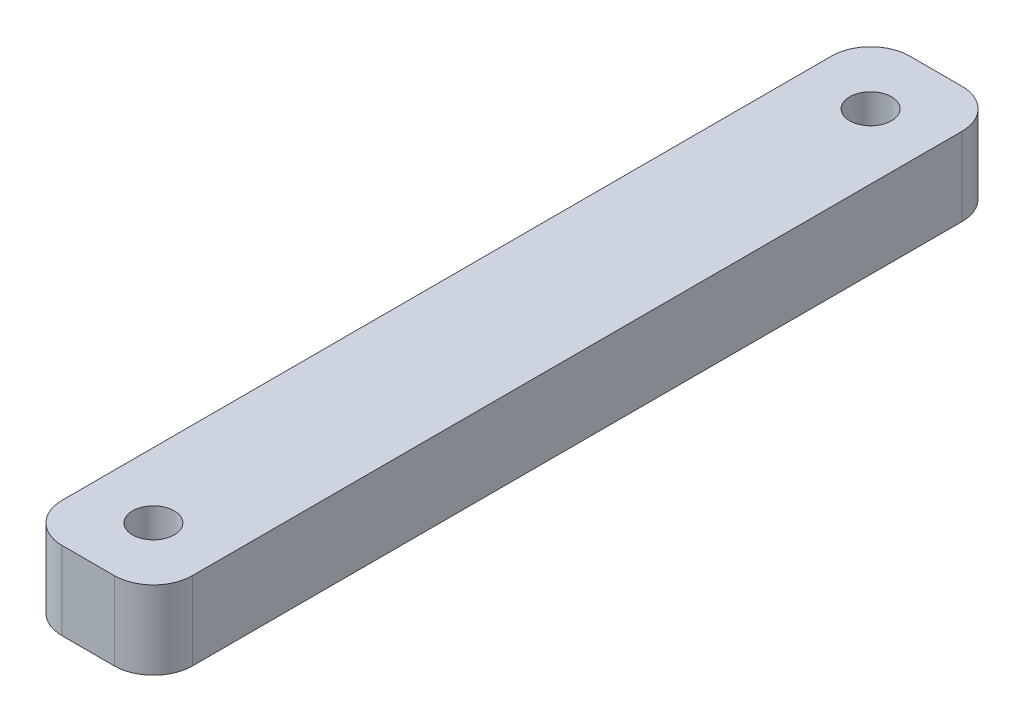
ISO-10303-21;
HEADER;
FILE_DESCRIPTION(('STEP AP214'),'2;1');
FILE_NAME('part.step','',(''),(''),'','','');
FILE_SCHEMA(('AUTOMOTIVE_DESIGN { 1 0 10303 214 1 1 1 1 }'));
ENDSEC;
DATA;
#1=APPLICATION_CONTEXT('core data for automotive mechanical design processes');
#2=APPLICATION_PROTOCOL_DEFINITION('international standard','automotive_design',2000,#1);
#3=PRODUCT_CONTEXT('',#1,'mechanical');
#4=PRODUCT('Part','Part','',(#3));
#5=PRODUCT_RELATED_PRODUCT_CATEGORY('part','',(#4));
#6=PRODUCT_DEFINITION_FORMATION('','',#4);
#7=PRODUCT_DEFINITION_CONTEXT('part definition',#1,'design');
#8=PRODUCT_DEFINITION('design','',#6,#7);
#9=PRODUCT_DEFINITION_SHAPE('','',#8);
#10=(LENGTH_UNIT() NAMED_UNIT(*) SI_UNIT(.MILLI.,.METRE.));
#11=(NAMED_UNIT(*) PLANE_ANGLE_UNIT() SI_UNIT($,.RADIAN.));
#12=(NAMED_UNIT(*) SI_UNIT($,.STERADIAN.) SOLID_ANGLE_UNIT());
#13=UNCERTAINTY_MEASURE_WITH_UNIT(LENGTH_MEASURE(1.E-05),#10,'distance_accuracy_value','');
#14=(GEOMETRIC_REPRESENTATION_CONTEXT(3) GLOBAL_UNCERTAINTY_ASSIGNED_CONTEXT((#13)) GLOBAL_UNIT_ASSIGNED_CONTEXT((#10,
#11,#12)) REPRESENTATION_CONTEXT('',''));
#15=CARTESIAN_POINT('',(0.,0.,0.));
#16=DIRECTION('',(0.,0.,1.));
#17=DIRECTION('',(1.,0.,0.));
#18=AXIS2_PLACEMENT_3D('',#15,#16,#17);
#19=CARTESIAN_POINT('',(0.,0.,65.));
#20=DIRECTION('',(1.,0.,0.));
#21=DIRECTION('',(0.,1.,0.));
#22=AXIS2_PLACEMENT_3D('',#19,#20,#21);
#23=PLANE('',#22);
#24=DIRECTION('',(0.,0.,-1.));
#25=VECTOR('',#24,1.);
#26=CARTESIAN_POINT('',(0.,0.,65.));
#27=LINE('',#26,#25);
#28=CARTESIAN_POINT('',(0.,0.,62.));
#29=VERTEX_POINT('',#28);
#30=CARTESIAN_POINT('',(0.,0.,3.));
#31=VERTEX_POINT('',#30);
#32=EDGE_CURVE('E165',#29,#31,#27,.T.);
#33=ORIENTED_EDGE('',*,*,#32,.T.);
#34=DIRECTION('',(0.,-1.,0.));
#35=VECTOR('',#34,1.);
#36=CARTESIAN_POINT('',(0.,0.,3.));
#37=LINE('',#36,#35);
#38=CARTESIAN_POINT('',(0.,-6.,3.));
#39=VERTEX_POINT('',#38);
#40=EDGE_CURVE('E129',#31,#39,#37,.T.);
#41=ORIENTED_EDGE('',*,*,#40,.T.);
#42=DIRECTION('',(0.,0.,-1.));
#43=VECTOR('',#42,1.);
#44=CARTESIAN_POINT('',(0.,-6.,65.));
#45=LINE('',#44,#43);
#46=CARTESIAN_POINT('',(0.,-6.,62.));
#47=VERTEX_POINT('',#46);
#48=EDGE_CURVE('E114',#47,#39,#45,.T.);
#49=ORIENTED_EDGE('',*,*,#48,.F.);
#50=DIRECTION('',(0.,-1.,0.));
#51=VECTOR('',#50,1.);
#52=CARTESIAN_POINT('',(0.,0.,62.));
#53=LINE('',#52,#51);
#54=EDGE_CURVE('E126',#47,#29,#53,.F.);
#55=ORIENTED_EDGE('',*,*,#54,.T.);
#56=EDGE_LOOP('',(#33,#41,#49,#55));
#57=FACE_BOUND('',#56,.T.);
#58=ADVANCED_FACE('F44',(#57),#23,.F.);
#59=CARTESIAN_POINT('',(0.,-6.,65.));
#60=DIRECTION('',(0.,1.,0.));
#61=DIRECTION('',(0.,0.,1.));
#62=AXIS2_PLACEMENT_3D('',#59,#60,#61);
#63=PLANE('',#62);
#64=CARTESIAN_POINT('',(5.,-6.,60.));
#65=DIRECTION('',(0.,1.,0.));
#66=DIRECTION('',(0.,0.,1.));
#67=AXIS2_PLACEMENT_3D('',#64,#65,#66);
#68=CIRCLE('',#67,1.59999999999997);
#69=CARTESIAN_POINT('',(5.,-6.,61.6));
#70=VERTEX_POINT('',#69);
#71=EDGE_CURVE('E301',#70,#70,#68,.T.);
#72=ORIENTED_EDGE('',*,*,#71,.T.);
#73=EDGE_LOOP('',(#72));
#74=FACE_BOUND('',#73,.T.);
#75=CARTESIAN_POINT('',(5.,-6.,5.));
#76=DIRECTION('',(0.,1.,0.));
#77=DIRECTION('',(0.,0.,1.));
#78=AXIS2_PLACEMENT_3D('',#75,#76,#77);
#79=CIRCLE('',#78,1.6);
#80=CARTESIAN_POINT('',(5.,-6.,6.6));
#81=VERTEX_POINT('',#80);
#82=EDGE_CURVE('E176',#81,#81,#79,.T.);
#83=ORIENTED_EDGE('',*,*,#82,.T.);
#84=EDGE_LOOP('',(#83));
#85=FACE_BOUND('',#84,.T.);
#86=ORIENTED_EDGE('',*,*,#48,.T.);
#87=CARTESIAN_POINT('',(3.,-6.,3.));
#88=DIRECTION('',(0.,1.,0.));
#89=DIRECTION('',(0.,0.,1.));
#90=AXIS2_PLACEMENT_3D('',#87,#88,#89);
#91=CIRCLE('',#90,3.);
#92=CARTESIAN_POINT('',(3.,-6.,0.));
#93=VERTEX_POINT('',#92);
#94=EDGE_CURVE('E141',#39,#93,#91,.F.);
#95=ORIENTED_EDGE('',*,*,#94,.T.);
#96=DIRECTION('',(1.,0.,0.));
#97=VECTOR('',#96,1.);
#98=CARTESIAN_POINT('',(0.,-6.,0.));
#99=LINE('',#98,#97);
#100=CARTESIAN_POINT('',(7.,-6.,0.));
#101=VERTEX_POINT('',#100);
#102=EDGE_CURVE('E173',#93,#101,#99,.T.);
#103=ORIENTED_EDGE('',*,*,#102,.T.);
#104=CARTESIAN_POINT('',(7.,-6.,3.));
#105=DIRECTION('',(0.,1.,0.));
#106=DIRECTION('',(0.,0.,1.));
#107=AXIS2_PLACEMENT_3D('',#104,#105,#106);
#108=CIRCLE('',#107,3.);
#109=CARTESIAN_POINT('',(10.,-6.,3.));
#110=VERTEX_POINT('',#109);
#111=EDGE_CURVE('E120',#101,#110,#108,.F.);
#112=ORIENTED_EDGE('',*,*,#111,.T.);
#113=DIRECTION('',(0.,0.,-1.));
#114=VECTOR('',#113,1.);
#115=CARTESIAN_POINT('',(10.,-6.,65.));
#116=LINE('',#115,#114);
#117=CARTESIAN_POINT('',(10.,-6.,62.));
#118=VERTEX_POINT('',#117);
#119=EDGE_CURVE('E130',#118,#110,#116,.T.);
#120=ORIENTED_EDGE('',*,*,#119,.F.);
#121=CARTESIAN_POINT('',(7.,-6.,62.));
#122=DIRECTION('',(0.,1.,0.));
#123=DIRECTION('',(0.,0.,1.));
#124=AXIS2_PLACEMENT_3D('',#121,#122,#123);
#125=CIRCLE('',#124,3.);
#126=CARTESIAN_POINT('',(7.,-6.,65.));
#127=VERTEX_POINT('',#126);
#128=EDGE_CURVE('E121',#118,#127,#125,.F.);
#129=ORIENTED_EDGE('',*,*,#128,.T.);
#130=DIRECTION('',(1.,0.,0.));
#131=VECTOR('',#130,1.);
#132=CARTESIAN_POINT('',(0.,-6.,65.));
#133=LINE('',#132,#131);
#134=CARTESIAN_POINT('',(3.,-6.,65.));
#135=VERTEX_POINT('',#134);
#136=EDGE_CURVE('E116',#135,#127,#133,.T.);
#137=ORIENTED_EDGE('',*,*,#136,.F.);
#138=CARTESIAN_POINT('',(3.,-6.,62.));
#139=DIRECTION('',(0.,1.,0.));
#140=DIRECTION('',(0.,0.,1.));
#141=AXIS2_PLACEMENT_3D('',#138,#139,#140);
#142=CIRCLE('',#141,3.);
#143=EDGE_CURVE('E111',#135,#47,#142,.F.);
#144=ORIENTED_EDGE('',*,*,#143,.T.);
#145=EDGE_LOOP('',(#86,#95,#103,#112,#120,#129,#137,#144));
#146=FACE_BOUND('',#145,.T.);
#147=ADVANCED_FACE('F113',(#74,#85,#146),#63,.F.);
#148=CARTESIAN_POINT('',(10.,0.,65.));
#149=DIRECTION('',(-1.,0.,0.));
#150=DIRECTION('',(0.,-1.,0.));
#151=AXIS2_PLACEMENT_3D('',#148,#149,#150);
#152=PLANE('',#151);
#153=ORIENTED_EDGE('',*,*,#119,.T.);
#154=DIRECTION('',(0.,1.,0.));
#155=VECTOR('',#154,1.);
#156=CARTESIAN_POINT('',(10.,0.,3.));
#157=LINE('',#156,#155);
#158=CARTESIAN_POINT('',(10.,0.,3.));
#159=VERTEX_POINT('',#158);
#160=EDGE_CURVE('E154',#110,#159,#157,.T.);
#161=ORIENTED_EDGE('',*,*,#160,.T.);
#162=DIRECTION('',(0.,0.,-1.));
#163=VECTOR('',#162,1.);
#164=CARTESIAN_POINT('',(10.,0.,65.));
#165=LINE('',#164,#163);
#166=CARTESIAN_POINT('',(10.,0.,62.));
#167=VERTEX_POINT('',#166);
#168=EDGE_CURVE('E167',#167,#159,#165,.T.);
#169=ORIENTED_EDGE('',*,*,#168,.F.);
#170=DIRECTION('',(0.,1.,0.));
#171=VECTOR('',#170,1.);
#172=CARTESIAN_POINT('',(10.,-6.,62.));
#173=LINE('',#172,#171);
#174=EDGE_CURVE('E152',#167,#118,#173,.F.);
#175=ORIENTED_EDGE('',*,*,#174,.T.);
#176=EDGE_LOOP('',(#153,#161,#169,#175));
#177=FACE_BOUND('',#176,.T.);
#178=ADVANCED_FACE('F181',(#177),#152,.F.);
#179=CARTESIAN_POINT('',(0.,0.,65.));
#180=DIRECTION('',(0.,-1.,0.));
#181=DIRECTION('',(0.,0.,-1.));
#182=AXIS2_PLACEMENT_3D('',#179,#180,#181);
#183=PLANE('',#182);
#184=CARTESIAN_POINT('',(5.,0.,60.));
#185=DIRECTION('',(0.,1.,0.));
#186=DIRECTION('',(0.,0.,1.));
#187=AXIS2_PLACEMENT_3D('',#184,#185,#186);
#188=CIRCLE('',#187,1.59999999999997);
#189=CARTESIAN_POINT('',(5.,0.,61.6));
#190=VERTEX_POINT('',#189);
#191=EDGE_CURVE('E296',#190,#190,#188,.T.);
#192=ORIENTED_EDGE('',*,*,#191,.F.);
#193=EDGE_LOOP('',(#192));
#194=FACE_BOUND('',#193,.T.);
#195=CARTESIAN_POINT('',(5.,0.,5.));
#196=DIRECTION('',(0.,1.,0.));
#197=DIRECTION('',(0.,0.,1.));
#198=AXIS2_PLACEMENT_3D('',#195,#196,#197);
#199=CIRCLE('',#198,1.6);
#200=CARTESIAN_POINT('',(5.,0.,6.6));
#201=VERTEX_POINT('',#200);
#202=EDGE_CURVE('E299',#201,#201,#199,.T.);
#203=ORIENTED_EDGE('',*,*,#202,.F.);
#204=EDGE_LOOP('',(#203));
#205=FACE_BOUND('',#204,.T.);
#206=DIRECTION('',(-1.,0.,0.));
#207=VECTOR('',#206,1.);
#208=CARTESIAN_POINT('',(0.,0.,0.));
#209=LINE('',#208,#207);
#210=CARTESIAN_POINT('',(7.,0.,0.));
#211=VERTEX_POINT('',#210);
#212=CARTESIAN_POINT('',(3.,0.,0.));
#213=VERTEX_POINT('',#212);
#214=EDGE_CURVE('E169',#211,#213,#209,.T.);
#215=ORIENTED_EDGE('',*,*,#214,.T.);
#216=CARTESIAN_POINT('',(3.,0.,3.));
#217=DIRECTION('',(0.,-1.,0.));
#218=DIRECTION('',(0.,0.,-1.));
#219=AXIS2_PLACEMENT_3D('',#216,#217,#218);
#220=CIRCLE('',#219,3.);
#221=EDGE_CURVE('E150',#213,#31,#220,.F.);
#222=ORIENTED_EDGE('',*,*,#221,.T.);
#223=ORIENTED_EDGE('',*,*,#32,.F.);
#224=CARTESIAN_POINT('',(3.,0.,62.));
#225=DIRECTION('',(0.,-1.,0.));
#226=DIRECTION('',(0.,0.,-1.));
#227=AXIS2_PLACEMENT_3D('',#224,#225,#226);
#228=CIRCLE('',#227,3.);
#229=CARTESIAN_POINT('',(3.,0.,65.));
#230=VERTEX_POINT('',#229);
#231=EDGE_CURVE('E134',#29,#230,#228,.F.);
#232=ORIENTED_EDGE('',*,*,#231,.T.);
#233=DIRECTION('',(-1.,0.,0.));
#234=VECTOR('',#233,1.);
#235=CARTESIAN_POINT('',(0.,0.,65.));
#236=LINE('',#235,#234);
#237=CARTESIAN_POINT('',(7.,0.,65.));
#238=VERTEX_POINT('',#237);
#239=EDGE_CURVE('E160',#238,#230,#236,.T.);
#240=ORIENTED_EDGE('',*,*,#239,.F.);
#241=CARTESIAN_POINT('',(7.,0.,62.));
#242=DIRECTION('',(0.,-1.,0.));
#243=DIRECTION('',(0.,0.,-1.));
#244=AXIS2_PLACEMENT_3D('',#241,#242,#243);
#245=CIRCLE('',#244,3.);
#246=EDGE_CURVE('E67',#238,#167,#245,.F.);
#247=ORIENTED_EDGE('',*,*,#246,.T.);
#248=ORIENTED_EDGE('',*,*,#168,.T.);
#249=CARTESIAN_POINT('',(7.,0.,3.));
#250=DIRECTION('',(0.,-1.,0.));
#251=DIRECTION('',(0.,0.,-1.));
#252=AXIS2_PLACEMENT_3D('',#249,#250,#251);
#253=CIRCLE('',#252,3.);
#254=EDGE_CURVE('E59',#159,#211,#253,.F.);
#255=ORIENTED_EDGE('',*,*,#254,.T.);
#256=EDGE_LOOP('',(#215,#222,#223,#232,#240,#247,#248,#255));
#257=FACE_BOUND('',#256,.T.);
#258=ADVANCED_FACE('F164',(#194,#205,#257),#183,.F.);
#259=CARTESIAN_POINT('',(0.,0.,65.));
#260=DIRECTION('',(0.,0.,1.));
#261=DIRECTION('',(1.,0.,0.));
#262=AXIS2_PLACEMENT_3D('',#259,#260,#261);
#263=PLANE('',#262);
#264=ORIENTED_EDGE('',*,*,#239,.T.);
#265=DIRECTION('',(0.,-1.,0.));
#266=VECTOR('',#265,1.);
#267=CARTESIAN_POINT('',(3.,-6.,65.));
#268=LINE('',#267,#266);
#269=EDGE_CURVE('E13',#230,#135,#268,.T.);
#270=ORIENTED_EDGE('',*,*,#269,.T.);
#271=ORIENTED_EDGE('',*,*,#136,.T.);
#272=DIRECTION('',(0.,1.,0.));
#273=VECTOR('',#272,1.);
#274=CARTESIAN_POINT('',(7.,0.,65.));
#275=LINE('',#274,#273);
#276=EDGE_CURVE('E52',#127,#238,#275,.T.);
#277=ORIENTED_EDGE('',*,*,#276,.T.);
#278=EDGE_LOOP('',(#264,#270,#271,#277));
#279=FACE_BOUND('',#278,.T.);
#280=ADVANCED_FACE('F159',(#279),#263,.T.);
#281=CARTESIAN_POINT('',(0.,0.,0.));
#282=DIRECTION('',(0.,0.,1.));
#283=DIRECTION('',(1.,0.,0.));
#284=AXIS2_PLACEMENT_3D('',#281,#282,#283);
#285=PLANE('',#284);
#286=ORIENTED_EDGE('',*,*,#102,.F.);
#287=DIRECTION('',(0.,-1.,0.));
#288=VECTOR('',#287,1.);
#289=CARTESIAN_POINT('',(3.,0.,0.));
#290=LINE('',#289,#288);
#291=EDGE_CURVE('E145',#93,#213,#290,.F.);
#292=ORIENTED_EDGE('',*,*,#291,.T.);
#293=ORIENTED_EDGE('',*,*,#214,.F.);
#294=DIRECTION('',(0.,1.,0.));
#295=VECTOR('',#294,1.);
#296=CARTESIAN_POINT('',(7.,0.,0.));
#297=LINE('',#296,#295);
#298=EDGE_CURVE('E143',#211,#101,#297,.F.);
#299=ORIENTED_EDGE('',*,*,#298,.T.);
#300=EDGE_LOOP('',(#286,#292,#293,#299));
#301=FACE_BOUND('',#300,.T.);
#302=ADVANCED_FACE('F188',(#301),#285,.F.);
#303=CARTESIAN_POINT('',(5.,-6.,5.));
#304=DIRECTION('',(0.,1.,0.));
#305=DIRECTION('',(0.,0.,1.));
#306=AXIS2_PLACEMENT_3D('',#303,#304,#305);
#307=CYLINDRICAL_SURFACE('',#306,1.6);
#308=ORIENTED_EDGE('',*,*,#82,.F.);
#309=EDGE_LOOP('',(#308));
#310=FACE_BOUND('',#309,.T.);
#311=ORIENTED_EDGE('',*,*,#202,.T.);
#312=EDGE_LOOP('',(#311));
#313=FACE_BOUND('',#312,.T.);
#314=ADVANCED_FACE('F239',(#310,#313),#307,.F.);
#315=CARTESIAN_POINT('',(5.,-6.,60.));
#316=DIRECTION('',(0.,1.,0.));
#317=DIRECTION('',(0.,0.,1.));
#318=AXIS2_PLACEMENT_3D('',#315,#316,#317);
#319=CYLINDRICAL_SURFACE('',#318,1.59999999999997);
#320=ORIENTED_EDGE('',*,*,#71,.F.);
#321=EDGE_LOOP('',(#320));
#322=FACE_BOUND('',#321,.T.);
#323=ORIENTED_EDGE('',*,*,#191,.T.);
#324=EDGE_LOOP('',(#323));
#325=FACE_BOUND('',#324,.T.);
#326=ADVANCED_FACE('F208',(#322,#325),#319,.F.);
#327=CARTESIAN_POINT('',(3.,0.,3.));
#328=DIRECTION('',(0.,-1.,0.));
#329=DIRECTION('',(1.,0.,0.));
#330=AXIS2_PLACEMENT_3D('',#327,#328,#329);
#331=CYLINDRICAL_SURFACE('',#330,3.);
#332=ORIENTED_EDGE('',*,*,#221,.F.);
#333=ORIENTED_EDGE('',*,*,#291,.F.);
#334=ORIENTED_EDGE('',*,*,#94,.F.);
#335=ORIENTED_EDGE('',*,*,#40,.F.);
#336=EDGE_LOOP('',(#332,#333,#334,#335));
#337=FACE_BOUND('',#336,.T.);
#338=ADVANCED_FACE('F192',(#337),#331,.T.);
#339=CARTESIAN_POINT('',(7.,0.,3.));
#340=DIRECTION('',(0.,1.,0.));
#341=DIRECTION('',(-1.,0.,0.));
#342=AXIS2_PLACEMENT_3D('',#339,#340,#341);
#343=CYLINDRICAL_SURFACE('',#342,3.);
#344=ORIENTED_EDGE('',*,*,#111,.F.);
#345=ORIENTED_EDGE('',*,*,#298,.F.);
#346=ORIENTED_EDGE('',*,*,#254,.F.);
#347=ORIENTED_EDGE('',*,*,#160,.F.);
#348=EDGE_LOOP('',(#344,#345,#346,#347));
#349=FACE_BOUND('',#348,.T.);
#350=ADVANCED_FACE('F184',(#349),#343,.T.);
#351=CARTESIAN_POINT('',(3.,0.,62.));
#352=DIRECTION('',(0.,1.,0.));
#353=DIRECTION('',(-1.,0.,0.));
#354=AXIS2_PLACEMENT_3D('',#351,#352,#353);
#355=CYLINDRICAL_SURFACE('',#354,3.);
#356=ORIENTED_EDGE('',*,*,#231,.F.);
#357=ORIENTED_EDGE('',*,*,#54,.F.);
#358=ORIENTED_EDGE('',*,*,#143,.F.);
#359=ORIENTED_EDGE('',*,*,#269,.F.);
#360=EDGE_LOOP('',(#356,#357,#358,#359));
#361=FACE_BOUND('',#360,.T.);
#362=ADVANCED_FACE('F133',(#361),#355,.T.);
#363=CARTESIAN_POINT('',(7.,0.,62.));
#364=DIRECTION('',(0.,-1.,0.));
#365=DIRECTION('',(1.,0.,0.));
#366=AXIS2_PLACEMENT_3D('',#363,#364,#365);
#367=CYLINDRICAL_SURFACE('',#366,3.);
#368=ORIENTED_EDGE('',*,*,#128,.F.);
#369=ORIENTED_EDGE('',*,*,#174,.F.);
#370=ORIENTED_EDGE('',*,*,#246,.F.);
#371=ORIENTED_EDGE('',*,*,#276,.F.);
#372=EDGE_LOOP('',(#368,#369,#370,#371));
#373=FACE_BOUND('',#372,.T.);
#374=ADVANCED_FACE('F46',(#373),#367,.T.);
#375=CLOSED_SHELL('',(#58,#147,#178,#258,#280,#302,#314,#326,#338,#350,#362,#374));
#376=MANIFOLD_SOLID_BREP('B2',#375);
#377=ADVANCED_BREP_SHAPE_REPRESENTATION('',(#18,#376),#14);
#378=SHAPE_DEFINITION_REPRESENTATION(#9,#377);
ENDSEC;
END-ISO-10303-21;
